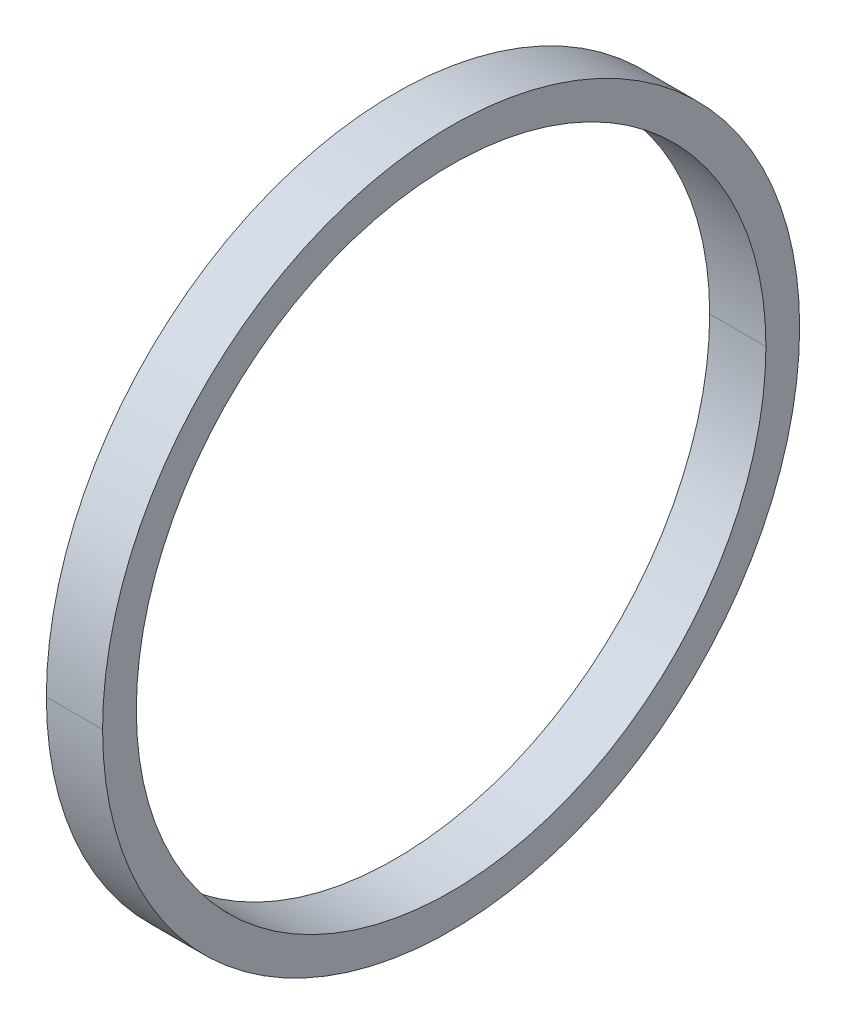
ISO-10303-21;
HEADER;
FILE_DESCRIPTION(('STEP AP214'),'2;1');
FILE_NAME('part.step','',(''),(''),'','','');
FILE_SCHEMA(('AUTOMOTIVE_DESIGN { 1 0 10303 214 1 1 1 1 }'));
ENDSEC;
DATA;
#1=APPLICATION_CONTEXT('core data for automotive mechanical design processes');
#2=APPLICATION_PROTOCOL_DEFINITION('international standard','automotive_design',2000,#1);
#3=PRODUCT_CONTEXT('',#1,'mechanical');
#4=PRODUCT('Part','Part','',(#3));
#5=PRODUCT_RELATED_PRODUCT_CATEGORY('part','',(#4));
#6=PRODUCT_DEFINITION_FORMATION('','',#4);
#7=PRODUCT_DEFINITION_CONTEXT('part definition',#1,'design');
#8=PRODUCT_DEFINITION('design','',#6,#7);
#9=PRODUCT_DEFINITION_SHAPE('','',#8);
#10=(LENGTH_UNIT() NAMED_UNIT(*) SI_UNIT(.MILLI.,.METRE.));
#11=(NAMED_UNIT(*) PLANE_ANGLE_UNIT() SI_UNIT($,.RADIAN.));
#12=(NAMED_UNIT(*) SI_UNIT($,.STERADIAN.) SOLID_ANGLE_UNIT());
#13=UNCERTAINTY_MEASURE_WITH_UNIT(LENGTH_MEASURE(1.E-05),#10,'distance_accuracy_value','');
#14=(GEOMETRIC_REPRESENTATION_CONTEXT(3) GLOBAL_UNCERTAINTY_ASSIGNED_CONTEXT((#13)) GLOBAL_UNIT_ASSIGNED_CONTEXT((#10,
#11,#12)) REPRESENTATION_CONTEXT('',''));
#15=CARTESIAN_POINT('',(0.,0.,0.));
#16=DIRECTION('',(0.,0.,1.));
#17=DIRECTION('',(1.,0.,0.));
#18=AXIS2_PLACEMENT_3D('',#15,#16,#17);
#19=CARTESIAN_POINT('',(0.,0.,0.));
#20=DIRECTION('',(1.,0.,0.));
#21=DIRECTION('',(0.,0.,-1.));
#22=AXIS2_PLACEMENT_3D('',#19,#20,#21);
#23=CYLINDRICAL_SURFACE('',#22,28.);
#24=DIRECTION('',(1.,0.,0.));
#25=VECTOR('',#24,1.);
#26=CARTESIAN_POINT('',(0.,0.,28.));
#27=LINE('',#26,#25);
#28=CARTESIAN_POINT('',(-13.,0.,28.));
#29=VERTEX_POINT('',#28);
#30=CARTESIAN_POINT('',(-8.,0.,28.));
#31=VERTEX_POINT('',#30);
#32=EDGE_CURVE('E73',#29,#31,#27,.T.);
#33=ORIENTED_EDGE('',*,*,#32,.F.);
#34=CARTESIAN_POINT('',(-13.,0.,0.));
#35=DIRECTION('',(1.,0.,0.));
#36=DIRECTION('',(0.,0.,-1.));
#37=AXIS2_PLACEMENT_3D('',#34,#35,#36);
#38=CIRCLE('',#37,28.);
#39=CARTESIAN_POINT('',(-13.,0.,-28.));
#40=VERTEX_POINT('',#39);
#41=EDGE_CURVE('E66',#40,#29,#38,.T.);
#42=ORIENTED_EDGE('',*,*,#41,.F.);
#43=DIRECTION('',(1.,0.,0.));
#44=VECTOR('',#43,1.);
#45=CARTESIAN_POINT('',(0.,0.,-28.));
#46=LINE('',#45,#44);
#47=CARTESIAN_POINT('',(-8.,0.,-28.));
#48=VERTEX_POINT('',#47);
#49=EDGE_CURVE('E20',#40,#48,#46,.T.);
#50=ORIENTED_EDGE('',*,*,#49,.T.);
#51=CARTESIAN_POINT('',(-8.,0.,0.));
#52=DIRECTION('',(1.,0.,0.));
#53=DIRECTION('',(0.,0.,-1.));
#54=AXIS2_PLACEMENT_3D('',#51,#52,#53);
#55=CIRCLE('',#54,28.);
#56=EDGE_CURVE('E11',#48,#31,#55,.T.);
#57=ORIENTED_EDGE('',*,*,#56,.T.);
#58=EDGE_LOOP('',(#33,#42,#50,#57));
#59=FACE_BOUND('',#58,.T.);
#60=ADVANCED_FACE('F16',(#59),#23,.F.);
#61=CARTESIAN_POINT('',(-8.,28.,0.));
#62=DIRECTION('',(1.,0.,0.));
#63=DIRECTION('',(0.,1.,0.));
#64=AXIS2_PLACEMENT_3D('',#61,#62,#63);
#65=PLANE('',#64);
#66=ORIENTED_EDGE('',*,*,#56,.F.);
#67=CARTESIAN_POINT('',(-8.,0.,0.));
#68=DIRECTION('',(1.,0.,0.));
#69=DIRECTION('',(0.,0.,-1.));
#70=AXIS2_PLACEMENT_3D('',#67,#68,#69);
#71=CIRCLE('',#70,28.);
#72=EDGE_CURVE('E77',#31,#48,#71,.T.);
#73=ORIENTED_EDGE('',*,*,#72,.F.);
#74=EDGE_LOOP('',(#66,#73));
#75=FACE_BOUND('',#74,.T.);
#76=CARTESIAN_POINT('',(-8.,0.,0.));
#77=DIRECTION('',(1.,0.,0.));
#78=DIRECTION('',(0.,0.,-1.));
#79=AXIS2_PLACEMENT_3D('',#76,#77,#78);
#80=CIRCLE('',#79,31.);
#81=CARTESIAN_POINT('',(-8.,0.,-31.));
#82=VERTEX_POINT('',#81);
#83=CARTESIAN_POINT('',(-8.,0.,31.));
#84=VERTEX_POINT('',#83);
#85=EDGE_CURVE('E107',#82,#84,#80,.T.);
#86=ORIENTED_EDGE('',*,*,#85,.T.);
#87=CARTESIAN_POINT('',(-8.,0.,0.));
#88=DIRECTION('',(1.,0.,0.));
#89=DIRECTION('',(0.,0.,-1.));
#90=AXIS2_PLACEMENT_3D('',#87,#88,#89);
#91=CIRCLE('',#90,31.);
#92=EDGE_CURVE('E27',#84,#82,#91,.T.);
#93=ORIENTED_EDGE('',*,*,#92,.T.);
#94=EDGE_LOOP('',(#86,#93));
#95=FACE_BOUND('',#94,.T.);
#96=ADVANCED_FACE('F78',(#75,#95),#65,.T.);
#97=CARTESIAN_POINT('',(0.,0.,0.));
#98=DIRECTION('',(1.,0.,0.));
#99=DIRECTION('',(0.,0.,-1.));
#100=AXIS2_PLACEMENT_3D('',#97,#98,#99);
#101=CYLINDRICAL_SURFACE('',#100,31.);
#102=DIRECTION('',(1.,0.,0.));
#103=VECTOR('',#102,1.);
#104=CARTESIAN_POINT('',(0.,0.,31.));
#105=LINE('',#104,#103);
#106=CARTESIAN_POINT('',(-13.,0.,31.));
#107=VERTEX_POINT('',#106);
#108=EDGE_CURVE('E99',#107,#84,#105,.T.);
#109=ORIENTED_EDGE('',*,*,#108,.F.);
#110=CARTESIAN_POINT('',(-13.,0.,0.));
#111=DIRECTION('',(1.,0.,0.));
#112=DIRECTION('',(0.,0.,-1.));
#113=AXIS2_PLACEMENT_3D('',#110,#111,#112);
#114=CIRCLE('',#113,31.);
#115=CARTESIAN_POINT('',(-13.,0.,-31.));
#116=VERTEX_POINT('',#115);
#117=EDGE_CURVE('E95',#107,#116,#114,.T.);
#118=ORIENTED_EDGE('',*,*,#117,.T.);
#119=DIRECTION('',(1.,0.,0.));
#120=VECTOR('',#119,1.);
#121=CARTESIAN_POINT('',(0.,0.,-31.));
#122=LINE('',#121,#120);
#123=EDGE_CURVE('E249',#116,#82,#122,.T.);
#124=ORIENTED_EDGE('',*,*,#123,.T.);
#125=ORIENTED_EDGE('',*,*,#92,.F.);
#126=EDGE_LOOP('',(#109,#118,#124,#125));
#127=FACE_BOUND('',#126,.T.);
#128=ADVANCED_FACE('F124',(#127),#101,.T.);
#129=CARTESIAN_POINT('',(-13.,28.,0.));
#130=DIRECTION('',(-1.,0.,0.));
#131=DIRECTION('',(0.,0.,1.));
#132=AXIS2_PLACEMENT_3D('',#129,#130,#131);
#133=PLANE('',#132);
#134=ORIENTED_EDGE('',*,*,#41,.T.);
#135=CARTESIAN_POINT('',(-13.,0.,0.));
#136=DIRECTION('',(1.,0.,0.));
#137=DIRECTION('',(0.,0.,-1.));
#138=AXIS2_PLACEMENT_3D('',#135,#136,#137);
#139=CIRCLE('',#138,28.);
#140=EDGE_CURVE('E84',#29,#40,#139,.T.);
#141=ORIENTED_EDGE('',*,*,#140,.T.);
#142=EDGE_LOOP('',(#134,#141));
#143=FACE_BOUND('',#142,.T.);
#144=CARTESIAN_POINT('',(-13.,0.,0.));
#145=DIRECTION('',(1.,0.,0.));
#146=DIRECTION('',(0.,0.,-1.));
#147=AXIS2_PLACEMENT_3D('',#144,#145,#146);
#148=CIRCLE('',#147,31.);
#149=EDGE_CURVE('E96',#116,#107,#148,.T.);
#150=ORIENTED_EDGE('',*,*,#149,.F.);
#151=ORIENTED_EDGE('',*,*,#117,.F.);
#152=EDGE_LOOP('',(#150,#151));
#153=FACE_BOUND('',#152,.T.);
#154=ADVANCED_FACE('F148',(#143,#153),#133,.T.);
#155=CARTESIAN_POINT('',(0.,0.,0.));
#156=DIRECTION('',(1.,0.,0.));
#157=DIRECTION('',(0.,0.,-1.));
#158=AXIS2_PLACEMENT_3D('',#155,#156,#157);
#159=CYLINDRICAL_SURFACE('',#158,31.);
#160=ORIENTED_EDGE('',*,*,#149,.T.);
#161=ORIENTED_EDGE('',*,*,#108,.T.);
#162=ORIENTED_EDGE('',*,*,#85,.F.);
#163=ORIENTED_EDGE('',*,*,#123,.F.);
#164=EDGE_LOOP('',(#160,#161,#162,#163));
#165=FACE_BOUND('',#164,.T.);
#166=ADVANCED_FACE('F18',(#165),#159,.T.);
#167=CARTESIAN_POINT('',(0.,0.,0.));
#168=DIRECTION('',(1.,0.,0.));
#169=DIRECTION('',(0.,0.,-1.));
#170=AXIS2_PLACEMENT_3D('',#167,#168,#169);
#171=CYLINDRICAL_SURFACE('',#170,28.);
#172=ORIENTED_EDGE('',*,*,#140,.F.);
#173=ORIENTED_EDGE('',*,*,#32,.T.);
#174=ORIENTED_EDGE('',*,*,#72,.T.);
#175=ORIENTED_EDGE('',*,*,#49,.F.);
#176=EDGE_LOOP('',(#172,#173,#174,#175));
#177=FACE_BOUND('',#176,.T.);
#178=ADVANCED_FACE('F82',(#177),#171,.F.);
#179=CLOSED_SHELL('',(#60,#96,#128,#154,#166,#178));
#180=MANIFOLD_SOLID_BREP('B1',#179);
#181=ADVANCED_BREP_SHAPE_REPRESENTATION('',(#18,#180),#14);
#182=SHAPE_DEFINITION_REPRESENTATION(#9,#181);
ENDSEC;
END-ISO-10303-21;
